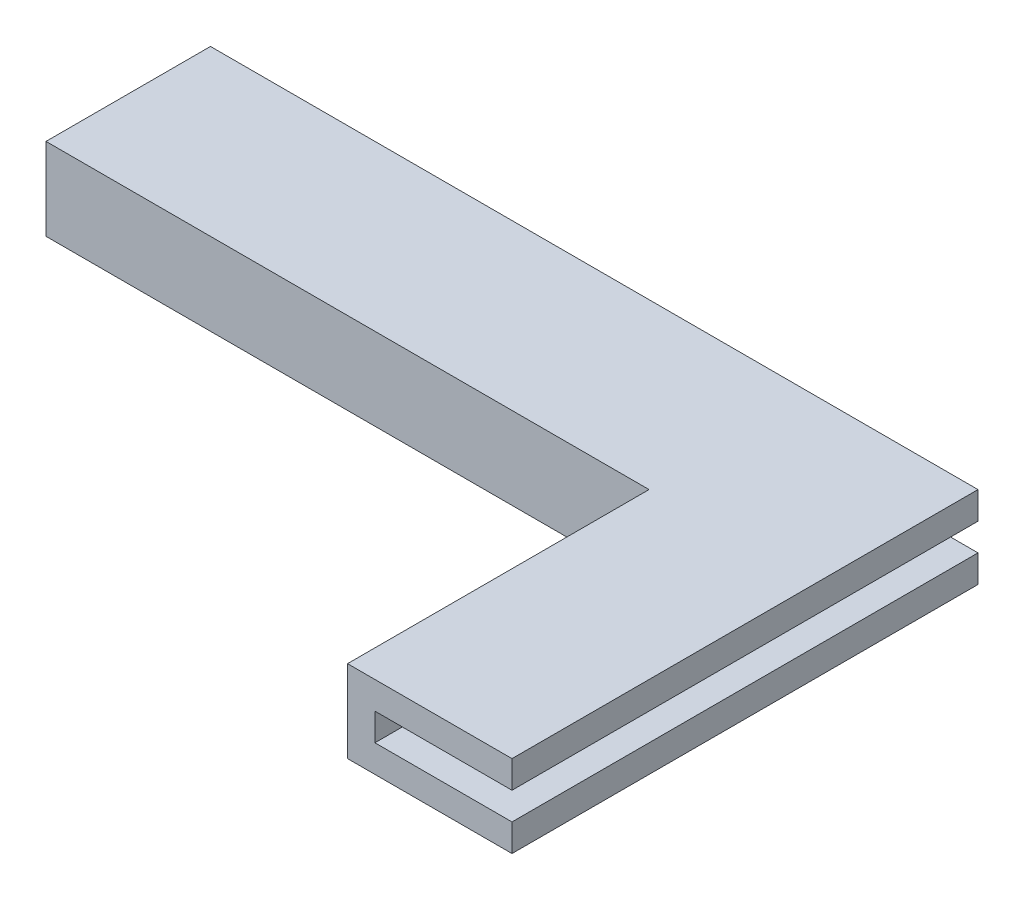
ISO-10303-21;
HEADER;
FILE_DESCRIPTION(('STEP AP214'),'2;1');
FILE_NAME('part.step','',(''),(''),'','','');
FILE_SCHEMA(('AUTOMOTIVE_DESIGN { 1 0 10303 214 1 1 1 1 }'));
ENDSEC;
DATA;
#1=APPLICATION_CONTEXT('core data for automotive mechanical design processes');
#2=APPLICATION_PROTOCOL_DEFINITION('international standard','automotive_design',2000,#1);
#3=PRODUCT_CONTEXT('',#1,'mechanical');
#4=PRODUCT('Part','Part','',(#3));
#5=PRODUCT_RELATED_PRODUCT_CATEGORY('part','',(#4));
#6=PRODUCT_DEFINITION_FORMATION('','',#4);
#7=PRODUCT_DEFINITION_CONTEXT('part definition',#1,'design');
#8=PRODUCT_DEFINITION('design','',#6,#7);
#9=PRODUCT_DEFINITION_SHAPE('','',#8);
#10=(LENGTH_UNIT() NAMED_UNIT(*) SI_UNIT(.MILLI.,.METRE.));
#11=(NAMED_UNIT(*) PLANE_ANGLE_UNIT() SI_UNIT($,.RADIAN.));
#12=(NAMED_UNIT(*) SI_UNIT($,.STERADIAN.) SOLID_ANGLE_UNIT());
#13=UNCERTAINTY_MEASURE_WITH_UNIT(LENGTH_MEASURE(1.E-05),#10,'distance_accuracy_value','');
#14=(GEOMETRIC_REPRESENTATION_CONTEXT(3) GLOBAL_UNCERTAINTY_ASSIGNED_CONTEXT((#13)) GLOBAL_UNIT_ASSIGNED_CONTEXT((#10,
#11,#12)) REPRESENTATION_CONTEXT('',''));
#15=CARTESIAN_POINT('',(0.,0.,0.));
#16=DIRECTION('',(0.,0.,1.));
#17=DIRECTION('',(1.,0.,0.));
#18=AXIS2_PLACEMENT_3D('',#15,#16,#17);
#19=CARTESIAN_POINT('',(0.,0.,5.));
#20=DIRECTION('',(0.,0.,1.));
#21=DIRECTION('',(1.,0.,0.));
#22=AXIS2_PLACEMENT_3D('',#19,#20,#21);
#23=PLANE('',#22);
#24=DIRECTION('',(1.,0.,0.));
#25=VECTOR('',#24,1.);
#26=CARTESIAN_POINT('',(0.,2.,5.));
#27=LINE('',#26,#25);
#28=CARTESIAN_POINT('',(0.,2.,5.));
#29=VERTEX_POINT('',#28);
#30=CARTESIAN_POINT('',(23.,2.,5.));
#31=VERTEX_POINT('',#30);
#32=EDGE_CURVE('E179',#29,#31,#27,.T.);
#33=ORIENTED_EDGE('',*,*,#32,.T.);
#34=DIRECTION('',(0.,1.,0.));
#35=VECTOR('',#34,1.);
#36=CARTESIAN_POINT('',(23.,1.,5.));
#37=LINE('',#36,#35);
#38=CARTESIAN_POINT('',(23.,1.,5.));
#39=VERTEX_POINT('',#38);
#40=EDGE_CURVE('E195',#39,#31,#37,.T.);
#41=ORIENTED_EDGE('',*,*,#40,.F.);
#42=DIRECTION('',(-1.,0.,0.));
#43=VECTOR('',#42,1.);
#44=CARTESIAN_POINT('',(0.,1.,5.));
#45=LINE('',#44,#43);
#46=CARTESIAN_POINT('',(0.,1.,5.));
#47=VERTEX_POINT('',#46);
#48=EDGE_CURVE('E62',#39,#47,#45,.T.);
#49=ORIENTED_EDGE('',*,*,#48,.T.);
#50=DIRECTION('',(0.,-1.,0.));
#51=VECTOR('',#50,1.);
#52=CARTESIAN_POINT('',(0.,3.,5.));
#53=LINE('',#52,#51);
#54=EDGE_CURVE('E189',#29,#47,#53,.T.);
#55=ORIENTED_EDGE('',*,*,#54,.F.);
#56=EDGE_LOOP('',(#33,#41,#49,#55));
#57=FACE_BOUND('',#56,.T.);
#58=ADVANCED_FACE('F39',(#57),#23,.F.);
#59=CARTESIAN_POINT('',(0.,0.,5.));
#60=DIRECTION('',(1.,0.,0.));
#61=DIRECTION('',(0.,0.,-1.));
#62=AXIS2_PLACEMENT_3D('',#59,#60,#61);
#63=PLANE('',#62);
#64=DIRECTION('',(0.,-1.,0.));
#65=VECTOR('',#64,1.);
#66=CARTESIAN_POINT('',(0.,0.,0.));
#67=LINE('',#66,#65);
#68=CARTESIAN_POINT('',(0.,1.,0.));
#69=VERTEX_POINT('',#68);
#70=CARTESIAN_POINT('',(0.,0.,0.));
#71=VERTEX_POINT('',#70);
#72=EDGE_CURVE('E209',#69,#71,#67,.T.);
#73=ORIENTED_EDGE('',*,*,#72,.T.);
#74=DIRECTION('',(0.,0.,-1.));
#75=VECTOR('',#74,1.);
#76=CARTESIAN_POINT('',(0.,0.,5.));
#77=LINE('',#76,#75);
#78=CARTESIAN_POINT('',(0.,0.,6.));
#79=VERTEX_POINT('',#78);
#80=EDGE_CURVE('E11',#79,#71,#77,.T.);
#81=ORIENTED_EDGE('',*,*,#80,.F.);
#82=DIRECTION('',(0.,-1.,0.));
#83=VECTOR('',#82,1.);
#84=CARTESIAN_POINT('',(0.,3.,6.));
#85=LINE('',#84,#83);
#86=CARTESIAN_POINT('',(0.,3.,6.));
#87=VERTEX_POINT('',#86);
#88=EDGE_CURVE('E191',#87,#79,#85,.T.);
#89=ORIENTED_EDGE('',*,*,#88,.F.);
#90=DIRECTION('',(0.,0.,-1.));
#91=VECTOR('',#90,1.);
#92=CARTESIAN_POINT('',(0.,3.,6.));
#93=LINE('',#92,#91);
#94=CARTESIAN_POINT('',(0.,3.,0.));
#95=VERTEX_POINT('',#94);
#96=EDGE_CURVE('E140',#87,#95,#93,.T.);
#97=ORIENTED_EDGE('',*,*,#96,.T.);
#98=DIRECTION('',(0.,-1.,0.));
#99=VECTOR('',#98,1.);
#100=CARTESIAN_POINT('',(0.,2.,0.));
#101=LINE('',#100,#99);
#102=CARTESIAN_POINT('',(0.,2.,0.));
#103=VERTEX_POINT('',#102);
#104=EDGE_CURVE('E186',#95,#103,#101,.T.);
#105=ORIENTED_EDGE('',*,*,#104,.T.);
#106=DIRECTION('',(0.,0.,-1.));
#107=VECTOR('',#106,1.);
#108=CARTESIAN_POINT('',(0.,2.,5.));
#109=LINE('',#108,#107);
#110=EDGE_CURVE('E176',#29,#103,#109,.T.);
#111=ORIENTED_EDGE('',*,*,#110,.F.);
#112=ORIENTED_EDGE('',*,*,#54,.T.);
#113=DIRECTION('',(0.,0.,-1.));
#114=VECTOR('',#113,1.);
#115=CARTESIAN_POINT('',(0.,1.,5.));
#116=LINE('',#115,#114);
#117=EDGE_CURVE('E211',#47,#69,#116,.T.);
#118=ORIENTED_EDGE('',*,*,#117,.T.);
#119=EDGE_LOOP('',(#73,#81,#89,#97,#105,#111,#112,#118));
#120=FACE_BOUND('',#119,.T.);
#121=ADVANCED_FACE('F41',(#120),#63,.F.);
#122=CARTESIAN_POINT('',(0.,0.,5.));
#123=DIRECTION('',(0.,1.,0.));
#124=DIRECTION('',(0.,0.,1.));
#125=AXIS2_PLACEMENT_3D('',#122,#123,#124);
#126=PLANE('',#125);
#127=DIRECTION('',(1.,0.,0.));
#128=VECTOR('',#127,1.);
#129=CARTESIAN_POINT('',(0.,0.,0.));
#130=LINE('',#129,#128);
#131=CARTESIAN_POINT('',(28.,0.,0.));
#132=VERTEX_POINT('',#131);
#133=EDGE_CURVE('E215',#71,#132,#130,.T.);
#134=ORIENTED_EDGE('',*,*,#133,.T.);
#135=DIRECTION('',(0.,0.,-1.));
#136=VECTOR('',#135,1.);
#137=CARTESIAN_POINT('',(28.,0.,5.));
#138=LINE('',#137,#136);
#139=CARTESIAN_POINT('',(28.,0.,17.));
#140=VERTEX_POINT('',#139);
#141=EDGE_CURVE('E47',#140,#132,#138,.T.);
#142=ORIENTED_EDGE('',*,*,#141,.F.);
#143=DIRECTION('',(1.,0.,0.));
#144=VECTOR('',#143,1.);
#145=CARTESIAN_POINT('',(22.,0.,17.));
#146=LINE('',#145,#144);
#147=CARTESIAN_POINT('',(22.,0.,17.));
#148=VERTEX_POINT('',#147);
#149=EDGE_CURVE('E160',#148,#140,#146,.T.);
#150=ORIENTED_EDGE('',*,*,#149,.F.);
#151=DIRECTION('',(0.,0.,-1.));
#152=VECTOR('',#151,1.);
#153=CARTESIAN_POINT('',(22.,0.,17.));
#154=LINE('',#153,#152);
#155=CARTESIAN_POINT('',(22.,0.,6.));
#156=VERTEX_POINT('',#155);
#157=EDGE_CURVE('E171',#148,#156,#154,.T.);
#158=ORIENTED_EDGE('',*,*,#157,.T.);
#159=DIRECTION('',(1.,0.,0.));
#160=VECTOR('',#159,1.);
#161=CARTESIAN_POINT('',(0.,0.,6.));
#162=LINE('',#161,#160);
#163=EDGE_CURVE('E194',#79,#156,#162,.T.);
#164=ORIENTED_EDGE('',*,*,#163,.F.);
#165=ORIENTED_EDGE('',*,*,#80,.T.);
#166=EDGE_LOOP('',(#134,#142,#150,#158,#164,#165));
#167=FACE_BOUND('',#166,.T.);
#168=ADVANCED_FACE('F257',(#167),#126,.F.);
#169=CARTESIAN_POINT('',(28.,0.,5.));
#170=DIRECTION('',(-1.,0.,0.));
#171=DIRECTION('',(0.,0.,1.));
#172=AXIS2_PLACEMENT_3D('',#169,#170,#171);
#173=PLANE('',#172);
#174=DIRECTION('',(0.,1.,0.));
#175=VECTOR('',#174,1.);
#176=CARTESIAN_POINT('',(28.,0.,0.));
#177=LINE('',#176,#175);
#178=CARTESIAN_POINT('',(28.,1.,0.));
#179=VERTEX_POINT('',#178);
#180=EDGE_CURVE('E217',#132,#179,#177,.T.);
#181=ORIENTED_EDGE('',*,*,#180,.T.);
#182=DIRECTION('',(0.,0.,-1.));
#183=VECTOR('',#182,1.);
#184=CARTESIAN_POINT('',(28.,1.,5.));
#185=LINE('',#184,#183);
#186=CARTESIAN_POINT('',(28.,1.,17.));
#187=VERTEX_POINT('',#186);
#188=EDGE_CURVE('E222',#187,#179,#185,.T.);
#189=ORIENTED_EDGE('',*,*,#188,.F.);
#190=DIRECTION('',(0.,1.,0.));
#191=VECTOR('',#190,1.);
#192=CARTESIAN_POINT('',(28.,0.,17.));
#193=LINE('',#192,#191);
#194=EDGE_CURVE('E163',#140,#187,#193,.T.);
#195=ORIENTED_EDGE('',*,*,#194,.F.);
#196=ORIENTED_EDGE('',*,*,#141,.T.);
#197=EDGE_LOOP('',(#181,#189,#195,#196));
#198=FACE_BOUND('',#197,.T.);
#199=ADVANCED_FACE('F228',(#198),#173,.F.);
#200=CARTESIAN_POINT('',(0.,1.,5.));
#201=DIRECTION('',(0.,-1.,0.));
#202=DIRECTION('',(0.,0.,-1.));
#203=AXIS2_PLACEMENT_3D('',#200,#201,#202);
#204=PLANE('',#203);
#205=DIRECTION('',(-1.,0.,0.));
#206=VECTOR('',#205,1.);
#207=CARTESIAN_POINT('',(0.,1.,0.));
#208=LINE('',#207,#206);
#209=EDGE_CURVE('E212',#179,#69,#208,.T.);
#210=ORIENTED_EDGE('',*,*,#209,.T.);
#211=ORIENTED_EDGE('',*,*,#117,.F.);
#212=ORIENTED_EDGE('',*,*,#48,.F.);
#213=DIRECTION('',(0.,0.,-1.));
#214=VECTOR('',#213,1.);
#215=CARTESIAN_POINT('',(23.,1.,6.));
#216=LINE('',#215,#214);
#217=CARTESIAN_POINT('',(23.,1.,17.));
#218=VERTEX_POINT('',#217);
#219=EDGE_CURVE('E207',#218,#39,#216,.T.);
#220=ORIENTED_EDGE('',*,*,#219,.F.);
#221=DIRECTION('',(-1.,0.,0.));
#222=VECTOR('',#221,1.);
#223=CARTESIAN_POINT('',(28.,1.,17.));
#224=LINE('',#223,#222);
#225=EDGE_CURVE('E166',#187,#218,#224,.T.);
#226=ORIENTED_EDGE('',*,*,#225,.F.);
#227=ORIENTED_EDGE('',*,*,#188,.T.);
#228=EDGE_LOOP('',(#210,#211,#212,#220,#226,#227));
#229=FACE_BOUND('',#228,.T.);
#230=ADVANCED_FACE('F235',(#229),#204,.F.);
#231=CARTESIAN_POINT('',(0.,0.,0.));
#232=DIRECTION('',(0.,0.,-1.));
#233=DIRECTION('',(-1.,0.,0.));
#234=AXIS2_PLACEMENT_3D('',#231,#232,#233);
#235=PLANE('',#234);
#236=ORIENTED_EDGE('',*,*,#72,.F.);
#237=ORIENTED_EDGE('',*,*,#209,.F.);
#238=ORIENTED_EDGE('',*,*,#180,.F.);
#239=ORIENTED_EDGE('',*,*,#133,.F.);
#240=EDGE_LOOP('',(#236,#237,#238,#239));
#241=FACE_BOUND('',#240,.T.);
#242=ADVANCED_FACE('F234',(#241),#235,.T.);
#243=CARTESIAN_POINT('',(23.,1.,6.));
#244=DIRECTION('',(-1.,0.,0.));
#245=DIRECTION('',(0.,0.,1.));
#246=AXIS2_PLACEMENT_3D('',#243,#244,#245);
#247=PLANE('',#246);
#248=ORIENTED_EDGE('',*,*,#40,.T.);
#249=DIRECTION('',(0.,0.,-1.));
#250=VECTOR('',#249,1.);
#251=CARTESIAN_POINT('',(23.,2.,6.));
#252=LINE('',#251,#250);
#253=CARTESIAN_POINT('',(23.,2.,17.));
#254=VERTEX_POINT('',#253);
#255=EDGE_CURVE('E204',#254,#31,#252,.T.);
#256=ORIENTED_EDGE('',*,*,#255,.F.);
#257=DIRECTION('',(0.,1.,0.));
#258=VECTOR('',#257,1.);
#259=CARTESIAN_POINT('',(23.,1.,17.));
#260=LINE('',#259,#258);
#261=EDGE_CURVE('E169',#218,#254,#260,.T.);
#262=ORIENTED_EDGE('',*,*,#261,.F.);
#263=ORIENTED_EDGE('',*,*,#219,.T.);
#264=EDGE_LOOP('',(#248,#256,#262,#263));
#265=FACE_BOUND('',#264,.T.);
#266=ADVANCED_FACE('F243',(#265),#247,.F.);
#267=CARTESIAN_POINT('',(23.,2.,6.));
#268=DIRECTION('',(0.,1.,0.));
#269=DIRECTION('',(0.,0.,1.));
#270=AXIS2_PLACEMENT_3D('',#267,#268,#269);
#271=PLANE('',#270);
#272=ORIENTED_EDGE('',*,*,#255,.T.);
#273=ORIENTED_EDGE('',*,*,#32,.F.);
#274=ORIENTED_EDGE('',*,*,#110,.T.);
#275=DIRECTION('',(1.,0.,0.));
#276=VECTOR('',#275,1.);
#277=CARTESIAN_POINT('',(0.,2.,0.));
#278=LINE('',#277,#276);
#279=CARTESIAN_POINT('',(28.,2.,0.));
#280=VERTEX_POINT('',#279);
#281=EDGE_CURVE('E183',#103,#280,#278,.T.);
#282=ORIENTED_EDGE('',*,*,#281,.T.);
#283=DIRECTION('',(0.,0.,-1.));
#284=VECTOR('',#283,1.);
#285=CARTESIAN_POINT('',(28.,2.,6.));
#286=LINE('',#285,#284);
#287=CARTESIAN_POINT('',(28.,2.,17.));
#288=VERTEX_POINT('',#287);
#289=EDGE_CURVE('E139',#288,#280,#286,.T.);
#290=ORIENTED_EDGE('',*,*,#289,.F.);
#291=DIRECTION('',(1.,0.,0.));
#292=VECTOR('',#291,1.);
#293=CARTESIAN_POINT('',(23.,2.,17.));
#294=LINE('',#293,#292);
#295=EDGE_CURVE('E155',#254,#288,#294,.T.);
#296=ORIENTED_EDGE('',*,*,#295,.F.);
#297=EDGE_LOOP('',(#272,#273,#274,#282,#290,#296));
#298=FACE_BOUND('',#297,.T.);
#299=ADVANCED_FACE('F246',(#298),#271,.F.);
#300=CARTESIAN_POINT('',(28.,2.,6.));
#301=DIRECTION('',(-1.,0.,0.));
#302=DIRECTION('',(0.,0.,1.));
#303=AXIS2_PLACEMENT_3D('',#300,#301,#302);
#304=PLANE('',#303);
#305=ORIENTED_EDGE('',*,*,#289,.T.);
#306=DIRECTION('',(0.,1.,0.));
#307=VECTOR('',#306,1.);
#308=CARTESIAN_POINT('',(28.,2.,0.));
#309=LINE('',#308,#307);
#310=CARTESIAN_POINT('',(28.,3.,0.));
#311=VERTEX_POINT('',#310);
#312=EDGE_CURVE('E135',#280,#311,#309,.T.);
#313=ORIENTED_EDGE('',*,*,#312,.T.);
#314=DIRECTION('',(0.,0.,-1.));
#315=VECTOR('',#314,1.);
#316=CARTESIAN_POINT('',(28.,3.,6.));
#317=LINE('',#316,#315);
#318=CARTESIAN_POINT('',(28.,3.,17.));
#319=VERTEX_POINT('',#318);
#320=EDGE_CURVE('E129',#319,#311,#317,.T.);
#321=ORIENTED_EDGE('',*,*,#320,.F.);
#322=DIRECTION('',(0.,1.,0.));
#323=VECTOR('',#322,1.);
#324=CARTESIAN_POINT('',(28.,3.,17.));
#325=LINE('',#324,#323);
#326=EDGE_CURVE('E133',#288,#319,#325,.T.);
#327=ORIENTED_EDGE('',*,*,#326,.F.);
#328=EDGE_LOOP('',(#305,#313,#321,#327));
#329=FACE_BOUND('',#328,.T.);
#330=ADVANCED_FACE('F131',(#329),#304,.F.);
#331=CARTESIAN_POINT('',(0.,3.,6.));
#332=DIRECTION('',(0.,-1.,0.));
#333=DIRECTION('',(0.,0.,-1.));
#334=AXIS2_PLACEMENT_3D('',#331,#332,#333);
#335=PLANE('',#334);
#336=ORIENTED_EDGE('',*,*,#320,.T.);
#337=DIRECTION('',(-1.,0.,0.));
#338=VECTOR('',#337,1.);
#339=CARTESIAN_POINT('',(0.,3.,0.));
#340=LINE('',#339,#338);
#341=EDGE_CURVE('E180',#311,#95,#340,.T.);
#342=ORIENTED_EDGE('',*,*,#341,.T.);
#343=ORIENTED_EDGE('',*,*,#96,.F.);
#344=DIRECTION('',(-1.,0.,0.));
#345=VECTOR('',#344,1.);
#346=CARTESIAN_POINT('',(0.,3.,6.));
#347=LINE('',#346,#345);
#348=CARTESIAN_POINT('',(22.,3.,6.));
#349=VERTEX_POINT('',#348);
#350=EDGE_CURVE('E197',#349,#87,#347,.T.);
#351=ORIENTED_EDGE('',*,*,#350,.F.);
#352=DIRECTION('',(0.,0.,-1.));
#353=VECTOR('',#352,1.);
#354=CARTESIAN_POINT('',(22.,3.,17.));
#355=LINE('',#354,#353);
#356=CARTESIAN_POINT('',(22.,3.,17.));
#357=VERTEX_POINT('',#356);
#358=EDGE_CURVE('E146',#357,#349,#355,.T.);
#359=ORIENTED_EDGE('',*,*,#358,.F.);
#360=DIRECTION('',(-1.,0.,0.));
#361=VECTOR('',#360,1.);
#362=CARTESIAN_POINT('',(28.,3.,17.));
#363=LINE('',#362,#361);
#364=EDGE_CURVE('E143',#319,#357,#363,.T.);
#365=ORIENTED_EDGE('',*,*,#364,.F.);
#366=EDGE_LOOP('',(#336,#342,#343,#351,#359,#365));
#367=FACE_BOUND('',#366,.T.);
#368=ADVANCED_FACE('F144',(#367),#335,.F.);
#369=CARTESIAN_POINT('',(0.,0.,6.));
#370=DIRECTION('',(0.,0.,1.));
#371=DIRECTION('',(1.,0.,0.));
#372=AXIS2_PLACEMENT_3D('',#369,#370,#371);
#373=PLANE('',#372);
#374=DIRECTION('',(0.,-1.,0.));
#375=VECTOR('',#374,1.);
#376=CARTESIAN_POINT('',(22.,3.,6.));
#377=LINE('',#376,#375);
#378=EDGE_CURVE('E54',#349,#156,#377,.T.);
#379=ORIENTED_EDGE('',*,*,#378,.F.);
#380=ORIENTED_EDGE('',*,*,#350,.T.);
#381=ORIENTED_EDGE('',*,*,#88,.T.);
#382=ORIENTED_EDGE('',*,*,#163,.T.);
#383=EDGE_LOOP('',(#379,#380,#381,#382));
#384=FACE_BOUND('',#383,.T.);
#385=ADVANCED_FACE('F253',(#384),#373,.T.);
#386=CARTESIAN_POINT('',(0.,0.,0.));
#387=DIRECTION('',(0.,0.,-1.));
#388=DIRECTION('',(-1.,0.,0.));
#389=AXIS2_PLACEMENT_3D('',#386,#387,#388);
#390=PLANE('',#389);
#391=ORIENTED_EDGE('',*,*,#104,.F.);
#392=ORIENTED_EDGE('',*,*,#341,.F.);
#393=ORIENTED_EDGE('',*,*,#312,.F.);
#394=ORIENTED_EDGE('',*,*,#281,.F.);
#395=EDGE_LOOP('',(#391,#392,#393,#394));
#396=FACE_BOUND('',#395,.T.);
#397=ADVANCED_FACE('F249',(#396),#390,.T.);
#398=CARTESIAN_POINT('',(22.,3.,17.));
#399=DIRECTION('',(1.,0.,0.));
#400=DIRECTION('',(0.,0.,-1.));
#401=AXIS2_PLACEMENT_3D('',#398,#399,#400);
#402=PLANE('',#401);
#403=ORIENTED_EDGE('',*,*,#378,.T.);
#404=ORIENTED_EDGE('',*,*,#157,.F.);
#405=DIRECTION('',(0.,-1.,0.));
#406=VECTOR('',#405,1.);
#407=CARTESIAN_POINT('',(22.,3.,17.));
#408=LINE('',#407,#406);
#409=EDGE_CURVE('E149',#357,#148,#408,.T.);
#410=ORIENTED_EDGE('',*,*,#409,.F.);
#411=ORIENTED_EDGE('',*,*,#358,.T.);
#412=EDGE_LOOP('',(#403,#404,#410,#411));
#413=FACE_BOUND('',#412,.T.);
#414=ADVANCED_FACE('F256',(#413),#402,.F.);
#415=CARTESIAN_POINT('',(0.,0.,17.));
#416=DIRECTION('',(0.,0.,1.));
#417=DIRECTION('',(1.,0.,0.));
#418=AXIS2_PLACEMENT_3D('',#415,#416,#417);
#419=PLANE('',#418);
#420=ORIENTED_EDGE('',*,*,#326,.T.);
#421=ORIENTED_EDGE('',*,*,#364,.T.);
#422=ORIENTED_EDGE('',*,*,#409,.T.);
#423=ORIENTED_EDGE('',*,*,#149,.T.);
#424=ORIENTED_EDGE('',*,*,#194,.T.);
#425=ORIENTED_EDGE('',*,*,#225,.T.);
#426=ORIENTED_EDGE('',*,*,#261,.T.);
#427=ORIENTED_EDGE('',*,*,#295,.T.);
#428=EDGE_LOOP('',(#420,#421,#422,#423,#424,#425,#426,#427));
#429=FACE_BOUND('',#428,.T.);
#430=ADVANCED_FACE('F152',(#429),#419,.T.);
#431=CLOSED_SHELL('',(#58,#121,#168,#199,#230,#242,#266,#299,#330,#368,#385,#397,#414,#430));
#432=MANIFOLD_SOLID_BREP('B2',#431);
#433=ADVANCED_BREP_SHAPE_REPRESENTATION('',(#18,#432),#14);
#434=SHAPE_DEFINITION_REPRESENTATION(#9,#433);
ENDSEC;
END-ISO-10303-21;
